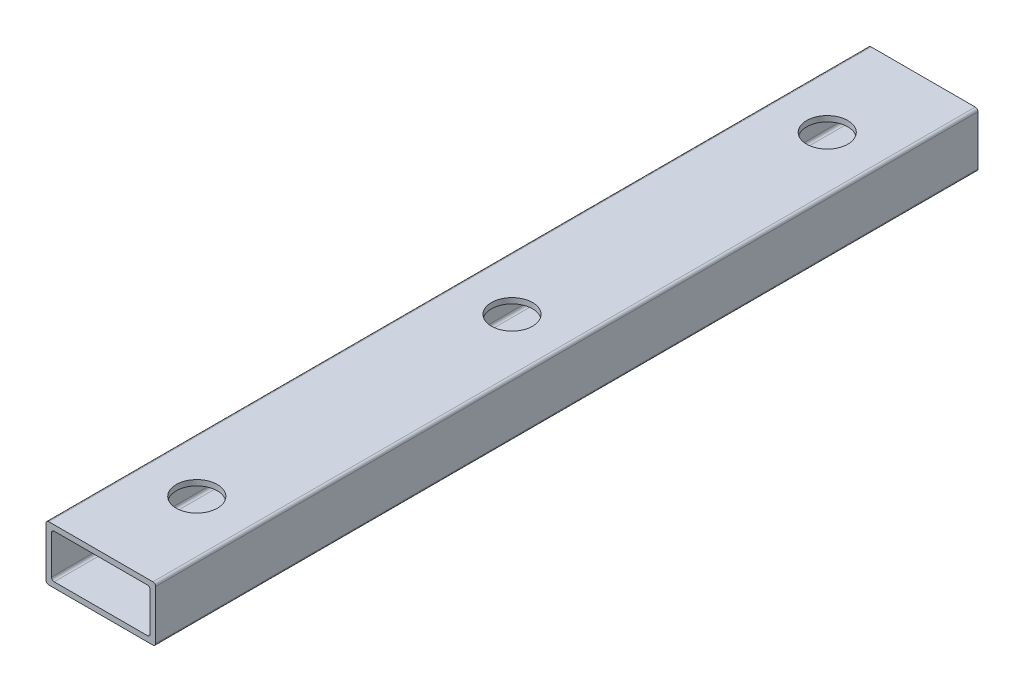
ISO-10303-21;
HEADER;
FILE_DESCRIPTION(('STEP AP214'),'2;1');
FILE_NAME('part.step','',(''),(''),'','','');
FILE_SCHEMA(('AUTOMOTIVE_DESIGN { 1 0 10303 214 1 1 1 1 }'));
ENDSEC;
DATA;
#1=APPLICATION_CONTEXT('core data for automotive mechanical design processes');
#2=APPLICATION_PROTOCOL_DEFINITION('international standard','automotive_design',2000,#1);
#3=PRODUCT_CONTEXT('',#1,'mechanical');
#4=PRODUCT('Part','Part','',(#3));
#5=PRODUCT_RELATED_PRODUCT_CATEGORY('part','',(#4));
#6=PRODUCT_DEFINITION_FORMATION('','',#4);
#7=PRODUCT_DEFINITION_CONTEXT('part definition',#1,'design');
#8=PRODUCT_DEFINITION('design','',#6,#7);
#9=PRODUCT_DEFINITION_SHAPE('','',#8);
#10=(LENGTH_UNIT() NAMED_UNIT(*) SI_UNIT(.MILLI.,.METRE.));
#11=(NAMED_UNIT(*) PLANE_ANGLE_UNIT() SI_UNIT($,.RADIAN.));
#12=(NAMED_UNIT(*) SI_UNIT($,.STERADIAN.) SOLID_ANGLE_UNIT());
#13=UNCERTAINTY_MEASURE_WITH_UNIT(LENGTH_MEASURE(1.E-05),#10,'distance_accuracy_value','');
#14=(GEOMETRIC_REPRESENTATION_CONTEXT(3) GLOBAL_UNCERTAINTY_ASSIGNED_CONTEXT((#13)) GLOBAL_UNIT_ASSIGNED_CONTEXT((#10,
#11,#12)) REPRESENTATION_CONTEXT('',''));
#15=CARTESIAN_POINT('',(0.,0.,0.));
#16=DIRECTION('',(0.,0.,1.));
#17=DIRECTION('',(1.,0.,0.));
#18=AXIS2_PLACEMENT_3D('',#15,#16,#17);
#19=CARTESIAN_POINT('',(78.,0.,600.));
#20=DIRECTION('',(0.,0.,-1.));
#21=DIRECTION('',(-1.,0.,0.));
#22=AXIS2_PLACEMENT_3D('',#19,#20,#21);
#23=PLANE('',#22);
#24=CARTESIAN_POINT('',(78.,0.,600.));
#25=DIRECTION('',(0.,0.,1.));
#26=DIRECTION('',(-1.,0.,0.));
#27=AXIS2_PLACEMENT_3D('',#24,#25,#26);
#28=CIRCLE('',#27,2.);
#29=CARTESIAN_POINT('',(78.,-2.,600.));
#30=VERTEX_POINT('',#29);
#31=CARTESIAN_POINT('',(80.,0.,600.));
#32=VERTEX_POINT('',#31);
#33=EDGE_CURVE('E215',#30,#32,#28,.T.);
#34=ORIENTED_EDGE('',*,*,#33,.T.);
#35=DIRECTION('',(0.,1.,0.));
#36=VECTOR('',#35,1.);
#37=CARTESIAN_POINT('',(80.,0.,600.));
#38=LINE('',#37,#36);
#39=CARTESIAN_POINT('',(80.,36.,600.));
#40=VERTEX_POINT('',#39);
#41=EDGE_CURVE('E218',#32,#40,#38,.T.);
#42=ORIENTED_EDGE('',*,*,#41,.T.);
#43=CARTESIAN_POINT('',(78.,36.,600.));
#44=DIRECTION('',(0.,0.,1.));
#45=DIRECTION('',(1.,0.,0.));
#46=AXIS2_PLACEMENT_3D('',#43,#44,#45);
#47=CIRCLE('',#46,2.);
#48=CARTESIAN_POINT('',(78.,38.,600.));
#49=VERTEX_POINT('',#48);
#50=EDGE_CURVE('E221',#40,#49,#47,.T.);
#51=ORIENTED_EDGE('',*,*,#50,.T.);
#52=DIRECTION('',(-1.,0.,0.));
#53=VECTOR('',#52,1.);
#54=CARTESIAN_POINT('',(2.,38.,600.));
#55=LINE('',#54,#53);
#56=CARTESIAN_POINT('',(2.,38.,600.));
#57=VERTEX_POINT('',#56);
#58=EDGE_CURVE('E223',#49,#57,#55,.T.);
#59=ORIENTED_EDGE('',*,*,#58,.T.);
#60=CARTESIAN_POINT('',(2.,36.,600.));
#61=DIRECTION('',(0.,0.,1.));
#62=DIRECTION('',(-1.,0.,0.));
#63=AXIS2_PLACEMENT_3D('',#60,#61,#62);
#64=CIRCLE('',#63,2.);
#65=CARTESIAN_POINT('',(0.,36.,600.));
#66=VERTEX_POINT('',#65);
#67=EDGE_CURVE('E225',#57,#66,#64,.T.);
#68=ORIENTED_EDGE('',*,*,#67,.T.);
#69=DIRECTION('',(0.,-1.,0.));
#70=VECTOR('',#69,1.);
#71=CARTESIAN_POINT('',(0.,0.,600.));
#72=LINE('',#71,#70);
#73=CARTESIAN_POINT('',(0.,0.,600.));
#74=VERTEX_POINT('',#73);
#75=EDGE_CURVE('E227',#66,#74,#72,.T.);
#76=ORIENTED_EDGE('',*,*,#75,.T.);
#77=CARTESIAN_POINT('',(2.,0.,600.));
#78=DIRECTION('',(0.,0.,1.));
#79=DIRECTION('',(1.,0.,0.));
#80=AXIS2_PLACEMENT_3D('',#77,#78,#79);
#81=CIRCLE('',#80,2.);
#82=CARTESIAN_POINT('',(2.,-2.,600.));
#83=VERTEX_POINT('',#82);
#84=EDGE_CURVE('E229',#74,#83,#81,.T.);
#85=ORIENTED_EDGE('',*,*,#84,.T.);
#86=DIRECTION('',(1.,0.,0.));
#87=VECTOR('',#86,1.);
#88=CARTESIAN_POINT('',(2.,-2.,600.));
#89=LINE('',#88,#87);
#90=EDGE_CURVE('E231',#83,#30,#89,.T.);
#91=ORIENTED_EDGE('',*,*,#90,.T.);
#92=EDGE_LOOP('',(#34,#42,#51,#59,#68,#76,#85,#91));
#93=FACE_BOUND('',#92,.T.);
#94=CARTESIAN_POINT('',(74.,4.,600.));
#95=DIRECTION('',(0.,0.,1.));
#96=DIRECTION('',(1.,0.,0.));
#97=AXIS2_PLACEMENT_3D('',#94,#95,#96);
#98=CIRCLE('',#97,2.);
#99=CARTESIAN_POINT('',(74.,2.,600.));
#100=VERTEX_POINT('',#99);
#101=CARTESIAN_POINT('',(76.,4.,600.));
#102=VERTEX_POINT('',#101);
#103=EDGE_CURVE('E148',#100,#102,#98,.T.);
#104=ORIENTED_EDGE('',*,*,#103,.F.);
#105=DIRECTION('',(1.,0.,0.));
#106=VECTOR('',#105,1.);
#107=CARTESIAN_POINT('',(6.,2.,600.));
#108=LINE('',#107,#106);
#109=CARTESIAN_POINT('',(6.00000000000001,2.,600.));
#110=VERTEX_POINT('',#109);
#111=EDGE_CURVE('E182',#110,#100,#108,.T.);
#112=ORIENTED_EDGE('',*,*,#111,.F.);
#113=CARTESIAN_POINT('',(6.,4.,600.));
#114=DIRECTION('',(0.,0.,1.));
#115=DIRECTION('',(-1.,0.,0.));
#116=AXIS2_PLACEMENT_3D('',#113,#114,#115);
#117=CIRCLE('',#116,2.);
#118=CARTESIAN_POINT('',(4.,4.,600.));
#119=VERTEX_POINT('',#118);
#120=EDGE_CURVE('E180',#119,#110,#117,.T.);
#121=ORIENTED_EDGE('',*,*,#120,.F.);
#122=DIRECTION('',(0.,-1.,0.));
#123=VECTOR('',#122,1.);
#124=CARTESIAN_POINT('',(4.,4.,600.));
#125=LINE('',#124,#123);
#126=CARTESIAN_POINT('',(4.,32.,600.));
#127=VERTEX_POINT('',#126);
#128=EDGE_CURVE('E178',#127,#119,#125,.T.);
#129=ORIENTED_EDGE('',*,*,#128,.F.);
#130=CARTESIAN_POINT('',(6.,32.,600.));
#131=DIRECTION('',(0.,0.,1.));
#132=DIRECTION('',(1.,0.,0.));
#133=AXIS2_PLACEMENT_3D('',#130,#131,#132);
#134=CIRCLE('',#133,2.);
#135=CARTESIAN_POINT('',(6.,34.,600.));
#136=VERTEX_POINT('',#135);
#137=EDGE_CURVE('E176',#136,#127,#134,.T.);
#138=ORIENTED_EDGE('',*,*,#137,.F.);
#139=DIRECTION('',(-1.,0.,0.));
#140=VECTOR('',#139,1.);
#141=CARTESIAN_POINT('',(6.,34.,600.));
#142=LINE('',#141,#140);
#143=CARTESIAN_POINT('',(74.,34.,600.));
#144=VERTEX_POINT('',#143);
#145=EDGE_CURVE('E171',#144,#136,#142,.T.);
#146=ORIENTED_EDGE('',*,*,#145,.F.);
#147=CARTESIAN_POINT('',(74.,32.,600.));
#148=DIRECTION('',(0.,0.,1.));
#149=DIRECTION('',(-1.,0.,0.));
#150=AXIS2_PLACEMENT_3D('',#147,#148,#149);
#151=CIRCLE('',#150,2.);
#152=CARTESIAN_POINT('',(76.,32.,600.));
#153=VERTEX_POINT('',#152);
#154=EDGE_CURVE('E169',#153,#144,#151,.T.);
#155=ORIENTED_EDGE('',*,*,#154,.F.);
#156=DIRECTION('',(0.,1.,0.));
#157=VECTOR('',#156,1.);
#158=CARTESIAN_POINT('',(76.,4.,600.));
#159=LINE('',#158,#157);
#160=EDGE_CURVE('E156',#102,#153,#159,.T.);
#161=ORIENTED_EDGE('',*,*,#160,.F.);
#162=EDGE_LOOP('',(#104,#112,#121,#129,#138,#146,#155,#161));
#163=FACE_BOUND('',#162,.T.);
#164=ADVANCED_FACE('F33',(#93,#163),#23,.F.);
#165=CARTESIAN_POINT('',(78.,0.,0.));
#166=DIRECTION('',(0.,0.,-1.));
#167=DIRECTION('',(-1.,0.,0.));
#168=AXIS2_PLACEMENT_3D('',#165,#166,#167);
#169=PLANE('',#168);
#170=CARTESIAN_POINT('',(78.,0.,0.));
#171=DIRECTION('',(0.,0.,1.));
#172=DIRECTION('',(-1.,0.,0.));
#173=AXIS2_PLACEMENT_3D('',#170,#171,#172);
#174=CIRCLE('',#173,2.);
#175=CARTESIAN_POINT('',(78.,-2.,0.));
#176=VERTEX_POINT('',#175);
#177=CARTESIAN_POINT('',(80.,0.,0.));
#178=VERTEX_POINT('',#177);
#179=EDGE_CURVE('E164',#176,#178,#174,.T.);
#180=ORIENTED_EDGE('',*,*,#179,.F.);
#181=DIRECTION('',(1.,0.,0.));
#182=VECTOR('',#181,1.);
#183=CARTESIAN_POINT('',(2.,-2.,0.));
#184=LINE('',#183,#182);
#185=CARTESIAN_POINT('',(2.,-2.,0.));
#186=VERTEX_POINT('',#185);
#187=EDGE_CURVE('E219',#186,#176,#184,.T.);
#188=ORIENTED_EDGE('',*,*,#187,.F.);
#189=CARTESIAN_POINT('',(2.,0.,0.));
#190=DIRECTION('',(0.,0.,1.));
#191=DIRECTION('',(1.,0.,0.));
#192=AXIS2_PLACEMENT_3D('',#189,#190,#191);
#193=CIRCLE('',#192,2.);
#194=CARTESIAN_POINT('',(0.,0.,0.));
#195=VERTEX_POINT('',#194);
#196=EDGE_CURVE('E246',#195,#186,#193,.T.);
#197=ORIENTED_EDGE('',*,*,#196,.F.);
#198=DIRECTION('',(0.,-1.,0.));
#199=VECTOR('',#198,1.);
#200=CARTESIAN_POINT('',(0.,0.,0.));
#201=LINE('',#200,#199);
#202=CARTESIAN_POINT('',(0.,36.,0.));
#203=VERTEX_POINT('',#202);
#204=EDGE_CURVE('E244',#203,#195,#201,.T.);
#205=ORIENTED_EDGE('',*,*,#204,.F.);
#206=CARTESIAN_POINT('',(2.,36.,0.));
#207=DIRECTION('',(0.,0.,1.));
#208=DIRECTION('',(-1.,0.,0.));
#209=AXIS2_PLACEMENT_3D('',#206,#207,#208);
#210=CIRCLE('',#209,2.);
#211=CARTESIAN_POINT('',(2.,38.,0.));
#212=VERTEX_POINT('',#211);
#213=EDGE_CURVE('E242',#212,#203,#210,.T.);
#214=ORIENTED_EDGE('',*,*,#213,.F.);
#215=DIRECTION('',(-1.,0.,0.));
#216=VECTOR('',#215,1.);
#217=CARTESIAN_POINT('',(2.,38.,0.));
#218=LINE('',#217,#216);
#219=CARTESIAN_POINT('',(78.,38.,0.));
#220=VERTEX_POINT('',#219);
#221=EDGE_CURVE('E240',#220,#212,#218,.T.);
#222=ORIENTED_EDGE('',*,*,#221,.F.);
#223=CARTESIAN_POINT('',(78.,36.,0.));
#224=DIRECTION('',(0.,0.,1.));
#225=DIRECTION('',(1.,0.,0.));
#226=AXIS2_PLACEMENT_3D('',#223,#224,#225);
#227=CIRCLE('',#226,2.);
#228=CARTESIAN_POINT('',(80.,36.,0.));
#229=VERTEX_POINT('',#228);
#230=EDGE_CURVE('E238',#229,#220,#227,.T.);
#231=ORIENTED_EDGE('',*,*,#230,.F.);
#232=DIRECTION('',(0.,1.,0.));
#233=VECTOR('',#232,1.);
#234=CARTESIAN_POINT('',(80.,0.,0.));
#235=LINE('',#234,#233);
#236=EDGE_CURVE('E236',#178,#229,#235,.T.);
#237=ORIENTED_EDGE('',*,*,#236,.F.);
#238=EDGE_LOOP('',(#180,#188,#197,#205,#214,#222,#231,#237));
#239=FACE_BOUND('',#238,.T.);
#240=DIRECTION('',(1.,0.,0.));
#241=VECTOR('',#240,1.);
#242=CARTESIAN_POINT('',(6.,2.,0.));
#243=LINE('',#242,#241);
#244=CARTESIAN_POINT('',(6.,2.,0.));
#245=VERTEX_POINT('',#244);
#246=CARTESIAN_POINT('',(74.,2.,0.));
#247=VERTEX_POINT('',#246);
#248=EDGE_CURVE('E157',#245,#247,#243,.T.);
#249=ORIENTED_EDGE('',*,*,#248,.T.);
#250=CARTESIAN_POINT('',(74.,4.,0.));
#251=DIRECTION('',(0.,0.,1.));
#252=DIRECTION('',(1.,0.,0.));
#253=AXIS2_PLACEMENT_3D('',#250,#251,#252);
#254=CIRCLE('',#253,2.);
#255=CARTESIAN_POINT('',(76.,4.,0.));
#256=VERTEX_POINT('',#255);
#257=EDGE_CURVE('E58',#247,#256,#254,.T.);
#258=ORIENTED_EDGE('',*,*,#257,.T.);
#259=DIRECTION('',(0.,1.,0.));
#260=VECTOR('',#259,1.);
#261=CARTESIAN_POINT('',(76.,4.,0.));
#262=LINE('',#261,#260);
#263=CARTESIAN_POINT('',(76.,32.,0.));
#264=VERTEX_POINT('',#263);
#265=EDGE_CURVE('E163',#256,#264,#262,.T.);
#266=ORIENTED_EDGE('',*,*,#265,.T.);
#267=CARTESIAN_POINT('',(74.,32.,0.));
#268=DIRECTION('',(0.,0.,1.));
#269=DIRECTION('',(-1.,0.,0.));
#270=AXIS2_PLACEMENT_3D('',#267,#268,#269);
#271=CIRCLE('',#270,2.);
#272=CARTESIAN_POINT('',(74.,34.,0.));
#273=VERTEX_POINT('',#272);
#274=EDGE_CURVE('E187',#264,#273,#271,.T.);
#275=ORIENTED_EDGE('',*,*,#274,.T.);
#276=DIRECTION('',(-1.,0.,0.));
#277=VECTOR('',#276,1.);
#278=CARTESIAN_POINT('',(6.,34.,0.));
#279=LINE('',#278,#277);
#280=CARTESIAN_POINT('',(6.,34.,0.));
#281=VERTEX_POINT('',#280);
#282=EDGE_CURVE('E190',#273,#281,#279,.T.);
#283=ORIENTED_EDGE('',*,*,#282,.T.);
#284=CARTESIAN_POINT('',(6.,32.,0.));
#285=DIRECTION('',(0.,0.,1.));
#286=DIRECTION('',(1.,0.,0.));
#287=AXIS2_PLACEMENT_3D('',#284,#285,#286);
#288=CIRCLE('',#287,2.);
#289=CARTESIAN_POINT('',(4.,32.,0.));
#290=VERTEX_POINT('',#289);
#291=EDGE_CURVE('E193',#281,#290,#288,.T.);
#292=ORIENTED_EDGE('',*,*,#291,.T.);
#293=DIRECTION('',(0.,-1.,0.));
#294=VECTOR('',#293,1.);
#295=CARTESIAN_POINT('',(4.,4.,0.));
#296=LINE('',#295,#294);
#297=CARTESIAN_POINT('',(4.,4.,0.));
#298=VERTEX_POINT('',#297);
#299=EDGE_CURVE('E196',#290,#298,#296,.T.);
#300=ORIENTED_EDGE('',*,*,#299,.T.);
#301=CARTESIAN_POINT('',(6.,4.,0.));
#302=DIRECTION('',(0.,0.,1.));
#303=DIRECTION('',(-1.,0.,0.));
#304=AXIS2_PLACEMENT_3D('',#301,#302,#303);
#305=CIRCLE('',#304,2.);
#306=EDGE_CURVE('E199',#298,#245,#305,.T.);
#307=ORIENTED_EDGE('',*,*,#306,.T.);
#308=EDGE_LOOP('',(#249,#258,#266,#275,#283,#292,#300,#307));
#309=FACE_BOUND('',#308,.T.);
#310=ADVANCED_FACE('F313',(#239,#309),#169,.T.);
#311=CARTESIAN_POINT('',(78.,0.,600.));
#312=DIRECTION('',(0.,0.,-1.));
#313=DIRECTION('',(-1.,0.,0.));
#314=AXIS2_PLACEMENT_3D('',#311,#312,#313);
#315=CYLINDRICAL_SURFACE('',#314,2.);
#316=ORIENTED_EDGE('',*,*,#179,.T.);
#317=DIRECTION('',(0.,0.,-1.));
#318=VECTOR('',#317,1.);
#319=CARTESIAN_POINT('',(80.,0.,600.));
#320=LINE('',#319,#318);
#321=EDGE_CURVE('E11',#32,#178,#320,.T.);
#322=ORIENTED_EDGE('',*,*,#321,.F.);
#323=ORIENTED_EDGE('',*,*,#33,.F.);
#324=DIRECTION('',(0.,0.,-1.));
#325=VECTOR('',#324,1.);
#326=CARTESIAN_POINT('',(78.,-2.,600.));
#327=LINE('',#326,#325);
#328=EDGE_CURVE('E233',#30,#176,#327,.T.);
#329=ORIENTED_EDGE('',*,*,#328,.T.);
#330=EDGE_LOOP('',(#316,#322,#323,#329));
#331=FACE_BOUND('',#330,.T.);
#332=ADVANCED_FACE('F35',(#331),#315,.T.);
#333=CARTESIAN_POINT('',(80.,0.,600.));
#334=DIRECTION('',(-1.,0.,0.));
#335=DIRECTION('',(0.,0.,1.));
#336=AXIS2_PLACEMENT_3D('',#333,#334,#335);
#337=PLANE('',#336);
#338=ORIENTED_EDGE('',*,*,#236,.T.);
#339=DIRECTION('',(0.,0.,-1.));
#340=VECTOR('',#339,1.);
#341=CARTESIAN_POINT('',(80.,36.,600.));
#342=LINE('',#341,#340);
#343=EDGE_CURVE('E42',#40,#229,#342,.T.);
#344=ORIENTED_EDGE('',*,*,#343,.F.);
#345=ORIENTED_EDGE('',*,*,#41,.F.);
#346=ORIENTED_EDGE('',*,*,#321,.T.);
#347=EDGE_LOOP('',(#338,#344,#345,#346));
#348=FACE_BOUND('',#347,.T.);
#349=ADVANCED_FACE('F353',(#348),#337,.F.);
#350=CARTESIAN_POINT('',(78.,36.,600.));
#351=DIRECTION('',(0.,0.,-1.));
#352=DIRECTION('',(-1.,0.,0.));
#353=AXIS2_PLACEMENT_3D('',#350,#351,#352);
#354=CYLINDRICAL_SURFACE('',#353,2.);
#355=ORIENTED_EDGE('',*,*,#230,.T.);
#356=DIRECTION('',(0.,0.,-1.));
#357=VECTOR('',#356,1.);
#358=CARTESIAN_POINT('',(78.,38.,600.));
#359=LINE('',#358,#357);
#360=EDGE_CURVE('E263',#49,#220,#359,.T.);
#361=ORIENTED_EDGE('',*,*,#360,.F.);
#362=ORIENTED_EDGE('',*,*,#50,.F.);
#363=ORIENTED_EDGE('',*,*,#343,.T.);
#364=EDGE_LOOP('',(#355,#361,#362,#363));
#365=FACE_BOUND('',#364,.T.);
#366=ADVANCED_FACE('F350',(#365),#354,.T.);
#367=CARTESIAN_POINT('',(2.,38.,600.));
#368=DIRECTION('',(0.,-1.,0.));
#369=DIRECTION('',(1.,0.,0.));
#370=AXIS2_PLACEMENT_3D('',#367,#368,#369);
#371=PLANE('',#370);
#372=CARTESIAN_POINT('',(40.0000000000001,38.,530.));
#373=DIRECTION('',(0.,1.,0.));
#374=DIRECTION('',(1.,0.,0.));
#375=AXIS2_PLACEMENT_3D('',#372,#373,#374);
#376=CIRCLE('',#375,15.);
#377=CARTESIAN_POINT('',(55.0000000000001,38.,530.));
#378=VERTEX_POINT('',#377);
#379=EDGE_CURVE('E554',#378,#378,#376,.T.);
#380=ORIENTED_EDGE('',*,*,#379,.F.);
#381=EDGE_LOOP('',(#380));
#382=FACE_BOUND('',#381,.T.);
#383=CARTESIAN_POINT('',(40.,38.,70.));
#384=DIRECTION('',(0.,1.,0.));
#385=DIRECTION('',(-1.,0.,0.));
#386=AXIS2_PLACEMENT_3D('',#383,#384,#385);
#387=CIRCLE('',#386,15.);
#388=CARTESIAN_POINT('',(25.,38.,70.));
#389=VERTEX_POINT('',#388);
#390=EDGE_CURVE('E281',#389,#389,#387,.T.);
#391=ORIENTED_EDGE('',*,*,#390,.F.);
#392=EDGE_LOOP('',(#391));
#393=FACE_BOUND('',#392,.T.);
#394=CARTESIAN_POINT('',(40.,38.,300.));
#395=DIRECTION('',(0.,1.,0.));
#396=DIRECTION('',(-1.,0.,0.));
#397=AXIS2_PLACEMENT_3D('',#394,#395,#396);
#398=CIRCLE('',#397,15.);
#399=CARTESIAN_POINT('',(25.,38.,300.));
#400=VERTEX_POINT('',#399);
#401=EDGE_CURVE('E278',#400,#400,#398,.T.);
#402=ORIENTED_EDGE('',*,*,#401,.F.);
#403=EDGE_LOOP('',(#402));
#404=FACE_BOUND('',#403,.T.);
#405=ORIENTED_EDGE('',*,*,#221,.T.);
#406=DIRECTION('',(0.,0.,-1.));
#407=VECTOR('',#406,1.);
#408=CARTESIAN_POINT('',(2.,38.,600.));
#409=LINE('',#408,#407);
#410=EDGE_CURVE('E260',#57,#212,#409,.T.);
#411=ORIENTED_EDGE('',*,*,#410,.F.);
#412=ORIENTED_EDGE('',*,*,#58,.F.);
#413=ORIENTED_EDGE('',*,*,#360,.T.);
#414=EDGE_LOOP('',(#405,#411,#412,#413));
#415=FACE_BOUND('',#414,.T.);
#416=ADVANCED_FACE('F346',(#382,#393,#404,#415),#371,.F.);
#417=CARTESIAN_POINT('',(2.,36.,600.));
#418=DIRECTION('',(0.,0.,-1.));
#419=DIRECTION('',(-1.,0.,0.));
#420=AXIS2_PLACEMENT_3D('',#417,#418,#419);
#421=CYLINDRICAL_SURFACE('',#420,2.);
#422=ORIENTED_EDGE('',*,*,#213,.T.);
#423=DIRECTION('',(0.,0.,-1.));
#424=VECTOR('',#423,1.);
#425=CARTESIAN_POINT('',(0.,36.,600.));
#426=LINE('',#425,#424);
#427=EDGE_CURVE('E257',#66,#203,#426,.T.);
#428=ORIENTED_EDGE('',*,*,#427,.F.);
#429=ORIENTED_EDGE('',*,*,#67,.F.);
#430=ORIENTED_EDGE('',*,*,#410,.T.);
#431=EDGE_LOOP('',(#422,#428,#429,#430));
#432=FACE_BOUND('',#431,.T.);
#433=ADVANCED_FACE('F342',(#432),#421,.T.);
#434=CARTESIAN_POINT('',(0.,0.,600.));
#435=DIRECTION('',(1.,0.,0.));
#436=DIRECTION('',(0.,0.,-1.));
#437=AXIS2_PLACEMENT_3D('',#434,#435,#436);
#438=PLANE('',#437);
#439=ORIENTED_EDGE('',*,*,#204,.T.);
#440=DIRECTION('',(0.,0.,-1.));
#441=VECTOR('',#440,1.);
#442=CARTESIAN_POINT('',(0.,0.,600.));
#443=LINE('',#442,#441);
#444=EDGE_CURVE('E254',#74,#195,#443,.T.);
#445=ORIENTED_EDGE('',*,*,#444,.F.);
#446=ORIENTED_EDGE('',*,*,#75,.F.);
#447=ORIENTED_EDGE('',*,*,#427,.T.);
#448=EDGE_LOOP('',(#439,#445,#446,#447));
#449=FACE_BOUND('',#448,.T.);
#450=ADVANCED_FACE('F338',(#449),#438,.F.);
#451=CARTESIAN_POINT('',(2.,0.,600.));
#452=DIRECTION('',(0.,0.,-1.));
#453=DIRECTION('',(-1.,0.,0.));
#454=AXIS2_PLACEMENT_3D('',#451,#452,#453);
#455=CYLINDRICAL_SURFACE('',#454,2.);
#456=ORIENTED_EDGE('',*,*,#196,.T.);
#457=DIRECTION('',(0.,0.,-1.));
#458=VECTOR('',#457,1.);
#459=CARTESIAN_POINT('',(2.,-2.,600.));
#460=LINE('',#459,#458);
#461=EDGE_CURVE('E251',#83,#186,#460,.T.);
#462=ORIENTED_EDGE('',*,*,#461,.F.);
#463=ORIENTED_EDGE('',*,*,#84,.F.);
#464=ORIENTED_EDGE('',*,*,#444,.T.);
#465=EDGE_LOOP('',(#456,#462,#463,#464));
#466=FACE_BOUND('',#465,.T.);
#467=ADVANCED_FACE('F334',(#466),#455,.T.);
#468=CARTESIAN_POINT('',(2.,-2.,600.));
#469=DIRECTION('',(0.,1.,0.));
#470=DIRECTION('',(0.,0.,1.));
#471=AXIS2_PLACEMENT_3D('',#468,#469,#470);
#472=PLANE('',#471);
#473=CARTESIAN_POINT('',(40.0000000000001,-2.,530.));
#474=DIRECTION('',(0.,1.,0.));
#475=DIRECTION('',(1.,0.,0.));
#476=AXIS2_PLACEMENT_3D('',#473,#474,#475);
#477=CIRCLE('',#476,15.);
#478=CARTESIAN_POINT('',(55.0000000000001,-2.,530.));
#479=VERTEX_POINT('',#478);
#480=EDGE_CURVE('E555',#479,#479,#477,.T.);
#481=ORIENTED_EDGE('',*,*,#480,.T.);
#482=EDGE_LOOP('',(#481));
#483=FACE_BOUND('',#482,.T.);
#484=CARTESIAN_POINT('',(40.,-2.,70.));
#485=DIRECTION('',(0.,1.,0.));
#486=DIRECTION('',(-1.,0.,0.));
#487=AXIS2_PLACEMENT_3D('',#484,#485,#486);
#488=CIRCLE('',#487,15.);
#489=CARTESIAN_POINT('',(25.,-2.,70.));
#490=VERTEX_POINT('',#489);
#491=EDGE_CURVE('E274',#490,#490,#488,.T.);
#492=ORIENTED_EDGE('',*,*,#491,.T.);
#493=EDGE_LOOP('',(#492));
#494=FACE_BOUND('',#493,.T.);
#495=CARTESIAN_POINT('',(40.,-2.,300.));
#496=DIRECTION('',(0.,1.,0.));
#497=DIRECTION('',(-1.,0.,0.));
#498=AXIS2_PLACEMENT_3D('',#495,#496,#497);
#499=CIRCLE('',#498,15.);
#500=CARTESIAN_POINT('',(25.,-2.,300.));
#501=VERTEX_POINT('',#500);
#502=EDGE_CURVE('E270',#501,#501,#499,.T.);
#503=ORIENTED_EDGE('',*,*,#502,.T.);
#504=EDGE_LOOP('',(#503));
#505=FACE_BOUND('',#504,.T.);
#506=ORIENTED_EDGE('',*,*,#187,.T.);
#507=ORIENTED_EDGE('',*,*,#328,.F.);
#508=ORIENTED_EDGE('',*,*,#90,.F.);
#509=ORIENTED_EDGE('',*,*,#461,.T.);
#510=EDGE_LOOP('',(#506,#507,#508,#509));
#511=FACE_BOUND('',#510,.T.);
#512=ADVANCED_FACE('F331',(#483,#494,#505,#511),#472,.F.);
#513=CARTESIAN_POINT('',(74.,4.,600.));
#514=DIRECTION('',(0.,0.,-1.));
#515=DIRECTION('',(-1.,0.,0.));
#516=AXIS2_PLACEMENT_3D('',#513,#514,#515);
#517=CYLINDRICAL_SURFACE('',#516,2.);
#518=ORIENTED_EDGE('',*,*,#257,.F.);
#519=DIRECTION('',(0.,0.,-1.));
#520=VECTOR('',#519,1.);
#521=CARTESIAN_POINT('',(74.,2.,600.));
#522=LINE('',#521,#520);
#523=EDGE_CURVE('E152',#100,#247,#522,.T.);
#524=ORIENTED_EDGE('',*,*,#523,.F.);
#525=ORIENTED_EDGE('',*,*,#103,.T.);
#526=DIRECTION('',(0.,0.,-1.));
#527=VECTOR('',#526,1.);
#528=CARTESIAN_POINT('',(76.,4.,600.));
#529=LINE('',#528,#527);
#530=EDGE_CURVE('E151',#102,#256,#529,.T.);
#531=ORIENTED_EDGE('',*,*,#530,.T.);
#532=EDGE_LOOP('',(#518,#524,#525,#531));
#533=FACE_BOUND('',#532,.T.);
#534=ADVANCED_FACE('F150',(#533),#517,.F.);
#535=CARTESIAN_POINT('',(76.,4.,600.));
#536=DIRECTION('',(-1.,0.,0.));
#537=DIRECTION('',(0.,0.,1.));
#538=AXIS2_PLACEMENT_3D('',#535,#536,#537);
#539=PLANE('',#538);
#540=ORIENTED_EDGE('',*,*,#265,.F.);
#541=ORIENTED_EDGE('',*,*,#530,.F.);
#542=ORIENTED_EDGE('',*,*,#160,.T.);
#543=DIRECTION('',(0.,0.,-1.));
#544=VECTOR('',#543,1.);
#545=CARTESIAN_POINT('',(76.,32.,600.));
#546=LINE('',#545,#544);
#547=EDGE_CURVE('E165',#153,#264,#546,.T.);
#548=ORIENTED_EDGE('',*,*,#547,.T.);
#549=EDGE_LOOP('',(#540,#541,#542,#548));
#550=FACE_BOUND('',#549,.T.);
#551=ADVANCED_FACE('F160',(#550),#539,.T.);
#552=CARTESIAN_POINT('',(74.,32.,600.));
#553=DIRECTION('',(0.,0.,-1.));
#554=DIRECTION('',(-1.,0.,0.));
#555=AXIS2_PLACEMENT_3D('',#552,#553,#554);
#556=CYLINDRICAL_SURFACE('',#555,2.);
#557=ORIENTED_EDGE('',*,*,#274,.F.);
#558=ORIENTED_EDGE('',*,*,#547,.F.);
#559=ORIENTED_EDGE('',*,*,#154,.T.);
#560=DIRECTION('',(0.,0.,-1.));
#561=VECTOR('',#560,1.);
#562=CARTESIAN_POINT('',(74.,34.,600.));
#563=LINE('',#562,#561);
#564=EDGE_CURVE('E212',#144,#273,#563,.T.);
#565=ORIENTED_EDGE('',*,*,#564,.T.);
#566=EDGE_LOOP('',(#557,#558,#559,#565));
#567=FACE_BOUND('',#566,.T.);
#568=ADVANCED_FACE('F304',(#567),#556,.F.);
#569=CARTESIAN_POINT('',(6.,34.,600.));
#570=DIRECTION('',(0.,-1.,0.));
#571=DIRECTION('',(0.,0.,-1.));
#572=AXIS2_PLACEMENT_3D('',#569,#570,#571);
#573=PLANE('',#572);
#574=CARTESIAN_POINT('',(40.0000000000001,34.,530.));
#575=DIRECTION('',(0.,-1.,0.));
#576=DIRECTION('',(0.,0.,-1.));
#577=AXIS2_PLACEMENT_3D('',#574,#575,#576);
#578=CIRCLE('',#577,15.);
#579=CARTESIAN_POINT('',(40.0000000000001,34.,515.));
#580=VERTEX_POINT('',#579);
#581=EDGE_CURVE('E286',#580,#580,#578,.T.);
#582=ORIENTED_EDGE('',*,*,#581,.F.);
#583=EDGE_LOOP('',(#582));
#584=FACE_BOUND('',#583,.T.);
#585=CARTESIAN_POINT('',(40.,34.,70.));
#586=DIRECTION('',(0.,-1.,0.));
#587=DIRECTION('',(0.,0.,-1.));
#588=AXIS2_PLACEMENT_3D('',#585,#586,#587);
#589=CIRCLE('',#588,15.);
#590=CARTESIAN_POINT('',(40.,34.,55.));
#591=VERTEX_POINT('',#590);
#592=EDGE_CURVE('E273',#591,#591,#589,.T.);
#593=ORIENTED_EDGE('',*,*,#592,.F.);
#594=EDGE_LOOP('',(#593));
#595=FACE_BOUND('',#594,.T.);
#596=CARTESIAN_POINT('',(40.,34.,300.));
#597=DIRECTION('',(0.,-1.,0.));
#598=DIRECTION('',(0.,0.,-1.));
#599=AXIS2_PLACEMENT_3D('',#596,#597,#598);
#600=CIRCLE('',#599,15.);
#601=CARTESIAN_POINT('',(40.,34.,285.));
#602=VERTEX_POINT('',#601);
#603=EDGE_CURVE('E185',#602,#602,#600,.T.);
#604=ORIENTED_EDGE('',*,*,#603,.F.);
#605=EDGE_LOOP('',(#604));
#606=FACE_BOUND('',#605,.T.);
#607=ORIENTED_EDGE('',*,*,#282,.F.);
#608=ORIENTED_EDGE('',*,*,#564,.F.);
#609=ORIENTED_EDGE('',*,*,#145,.T.);
#610=DIRECTION('',(0.,0.,-1.));
#611=VECTOR('',#610,1.);
#612=CARTESIAN_POINT('',(6.,34.,600.));
#613=LINE('',#612,#611);
#614=EDGE_CURVE('E210',#136,#281,#613,.T.);
#615=ORIENTED_EDGE('',*,*,#614,.T.);
#616=EDGE_LOOP('',(#607,#608,#609,#615));
#617=FACE_BOUND('',#616,.T.);
#618=ADVANCED_FACE('F300',(#584,#595,#606,#617),#573,.T.);
#619=CARTESIAN_POINT('',(6.,32.,600.));
#620=DIRECTION('',(0.,0.,-1.));
#621=DIRECTION('',(-1.,0.,0.));
#622=AXIS2_PLACEMENT_3D('',#619,#620,#621);
#623=CYLINDRICAL_SURFACE('',#622,2.);
#624=ORIENTED_EDGE('',*,*,#291,.F.);
#625=ORIENTED_EDGE('',*,*,#614,.F.);
#626=ORIENTED_EDGE('',*,*,#137,.T.);
#627=DIRECTION('',(0.,0.,-1.));
#628=VECTOR('',#627,1.);
#629=CARTESIAN_POINT('',(4.,32.,600.));
#630=LINE('',#629,#628);
#631=EDGE_CURVE('E208',#127,#290,#630,.T.);
#632=ORIENTED_EDGE('',*,*,#631,.T.);
#633=EDGE_LOOP('',(#624,#625,#626,#632));
#634=FACE_BOUND('',#633,.T.);
#635=ADVANCED_FACE('F303',(#634),#623,.F.);
#636=CARTESIAN_POINT('',(4.,4.,600.));
#637=DIRECTION('',(1.,0.,0.));
#638=DIRECTION('',(0.,0.,-1.));
#639=AXIS2_PLACEMENT_3D('',#636,#637,#638);
#640=PLANE('',#639);
#641=ORIENTED_EDGE('',*,*,#299,.F.);
#642=ORIENTED_EDGE('',*,*,#631,.F.);
#643=ORIENTED_EDGE('',*,*,#128,.T.);
#644=DIRECTION('',(0.,0.,-1.));
#645=VECTOR('',#644,1.);
#646=CARTESIAN_POINT('',(4.,4.,600.));
#647=LINE('',#646,#645);
#648=EDGE_CURVE('E206',#119,#298,#647,.T.);
#649=ORIENTED_EDGE('',*,*,#648,.T.);
#650=EDGE_LOOP('',(#641,#642,#643,#649));
#651=FACE_BOUND('',#650,.T.);
#652=ADVANCED_FACE('F463',(#651),#640,.T.);
#653=CARTESIAN_POINT('',(6.,4.,600.));
#654=DIRECTION('',(0.,0.,-1.));
#655=DIRECTION('',(-1.,0.,0.));
#656=AXIS2_PLACEMENT_3D('',#653,#654,#655);
#657=CYLINDRICAL_SURFACE('',#656,2.);
#658=ORIENTED_EDGE('',*,*,#306,.F.);
#659=ORIENTED_EDGE('',*,*,#648,.F.);
#660=ORIENTED_EDGE('',*,*,#120,.T.);
#661=DIRECTION('',(0.,0.,-1.));
#662=VECTOR('',#661,1.);
#663=CARTESIAN_POINT('',(6.,2.,600.));
#664=LINE('',#663,#662);
#665=EDGE_CURVE('E50',#110,#245,#664,.T.);
#666=ORIENTED_EDGE('',*,*,#665,.T.);
#667=EDGE_LOOP('',(#658,#659,#660,#666));
#668=FACE_BOUND('',#667,.T.);
#669=ADVANCED_FACE('F472',(#668),#657,.F.);
#670=CARTESIAN_POINT('',(6.,2.,600.));
#671=DIRECTION('',(0.,1.,0.));
#672=DIRECTION('',(0.,0.,1.));
#673=AXIS2_PLACEMENT_3D('',#670,#671,#672);
#674=PLANE('',#673);
#675=CARTESIAN_POINT('',(40.0000000000001,2.,530.));
#676=DIRECTION('',(0.,1.,0.));
#677=DIRECTION('',(0.,0.,1.));
#678=AXIS2_PLACEMENT_3D('',#675,#676,#677);
#679=CIRCLE('',#678,15.);
#680=CARTESIAN_POINT('',(40.0000000000001,2.,545.));
#681=VERTEX_POINT('',#680);
#682=EDGE_CURVE('E37',#681,#681,#679,.T.);
#683=ORIENTED_EDGE('',*,*,#682,.F.);
#684=EDGE_LOOP('',(#683));
#685=FACE_BOUND('',#684,.T.);
#686=CARTESIAN_POINT('',(40.,2.,70.));
#687=DIRECTION('',(0.,1.,0.));
#688=DIRECTION('',(0.,0.,1.));
#689=AXIS2_PLACEMENT_3D('',#686,#687,#688);
#690=CIRCLE('',#689,15.);
#691=CARTESIAN_POINT('',(40.,2.,85.));
#692=VERTEX_POINT('',#691);
#693=EDGE_CURVE('E271',#692,#692,#690,.T.);
#694=ORIENTED_EDGE('',*,*,#693,.F.);
#695=EDGE_LOOP('',(#694));
#696=FACE_BOUND('',#695,.T.);
#697=CARTESIAN_POINT('',(40.,2.,300.));
#698=DIRECTION('',(0.,1.,0.));
#699=DIRECTION('',(0.,0.,1.));
#700=AXIS2_PLACEMENT_3D('',#697,#698,#699);
#701=CIRCLE('',#700,15.);
#702=CARTESIAN_POINT('',(40.,2.,315.));
#703=VERTEX_POINT('',#702);
#704=EDGE_CURVE('E268',#703,#703,#701,.T.);
#705=ORIENTED_EDGE('',*,*,#704,.F.);
#706=EDGE_LOOP('',(#705));
#707=FACE_BOUND('',#706,.T.);
#708=ORIENTED_EDGE('',*,*,#248,.F.);
#709=ORIENTED_EDGE('',*,*,#665,.F.);
#710=ORIENTED_EDGE('',*,*,#111,.T.);
#711=ORIENTED_EDGE('',*,*,#523,.T.);
#712=EDGE_LOOP('',(#708,#709,#710,#711));
#713=FACE_BOUND('',#712,.T.);
#714=ADVANCED_FACE('F480',(#685,#696,#707,#713),#674,.T.);
#715=CARTESIAN_POINT('',(40.,-2.,300.));
#716=DIRECTION('',(0.,1.,0.));
#717=DIRECTION('',(-1.,0.,0.));
#718=AXIS2_PLACEMENT_3D('',#715,#716,#717);
#719=CYLINDRICAL_SURFACE('',#718,15.);
#720=ORIENTED_EDGE('',*,*,#704,.T.);
#721=EDGE_LOOP('',(#720));
#722=FACE_BOUND('',#721,.T.);
#723=ORIENTED_EDGE('',*,*,#502,.F.);
#724=EDGE_LOOP('',(#723));
#725=FACE_BOUND('',#724,.T.);
#726=ADVANCED_FACE('F488',(#722,#725),#719,.F.);
#727=ORIENTED_EDGE('',*,*,#603,.T.);
#728=EDGE_LOOP('',(#727));
#729=FACE_BOUND('',#728,.T.);
#730=ORIENTED_EDGE('',*,*,#401,.T.);
#731=EDGE_LOOP('',(#730));
#732=FACE_BOUND('',#731,.T.);
#733=ADVANCED_FACE('F297',(#729,#732),#719,.F.);
#734=CARTESIAN_POINT('',(40.,-2.,70.));
#735=DIRECTION('',(0.,1.,0.));
#736=DIRECTION('',(-1.,0.,0.));
#737=AXIS2_PLACEMENT_3D('',#734,#735,#736);
#738=CYLINDRICAL_SURFACE('',#737,15.);
#739=ORIENTED_EDGE('',*,*,#693,.T.);
#740=EDGE_LOOP('',(#739));
#741=FACE_BOUND('',#740,.T.);
#742=ORIENTED_EDGE('',*,*,#491,.F.);
#743=EDGE_LOOP('',(#742));
#744=FACE_BOUND('',#743,.T.);
#745=ADVANCED_FACE('F505',(#741,#744),#738,.F.);
#746=ORIENTED_EDGE('',*,*,#592,.T.);
#747=EDGE_LOOP('',(#746));
#748=FACE_BOUND('',#747,.T.);
#749=ORIENTED_EDGE('',*,*,#390,.T.);
#750=EDGE_LOOP('',(#749));
#751=FACE_BOUND('',#750,.T.);
#752=ADVANCED_FACE('F512',(#748,#751),#738,.F.);
#753=CARTESIAN_POINT('',(40.0000000000001,-2.,530.));
#754=DIRECTION('',(0.,1.,0.));
#755=DIRECTION('',(-1.,0.,0.));
#756=AXIS2_PLACEMENT_3D('',#753,#754,#755);
#757=CYLINDRICAL_SURFACE('',#756,15.);
#758=ORIENTED_EDGE('',*,*,#682,.T.);
#759=EDGE_LOOP('',(#758));
#760=FACE_BOUND('',#759,.T.);
#761=ORIENTED_EDGE('',*,*,#480,.F.);
#762=EDGE_LOOP('',(#761));
#763=FACE_BOUND('',#762,.T.);
#764=ADVANCED_FACE('F520',(#760,#763),#757,.F.);
#765=ORIENTED_EDGE('',*,*,#581,.T.);
#766=EDGE_LOOP('',(#765));
#767=FACE_BOUND('',#766,.T.);
#768=ORIENTED_EDGE('',*,*,#379,.T.);
#769=EDGE_LOOP('',(#768));
#770=FACE_BOUND('',#769,.T.);
#771=ADVANCED_FACE('F528',(#767,#770),#757,.F.);
#772=CLOSED_SHELL('',(#164,#310,#332,#349,#366,#416,#433,#450,#467,#512,#534,#551,#568,#618,
#635,#652,#669,#714,#726,#733,#745,#752,#764,#771));
#773=MANIFOLD_SOLID_BREP('B2',#772);
#774=ADVANCED_BREP_SHAPE_REPRESENTATION('',(#18,#773),#14);
#775=SHAPE_DEFINITION_REPRESENTATION(#9,#774);
ENDSEC;
END-ISO-10303-21;
